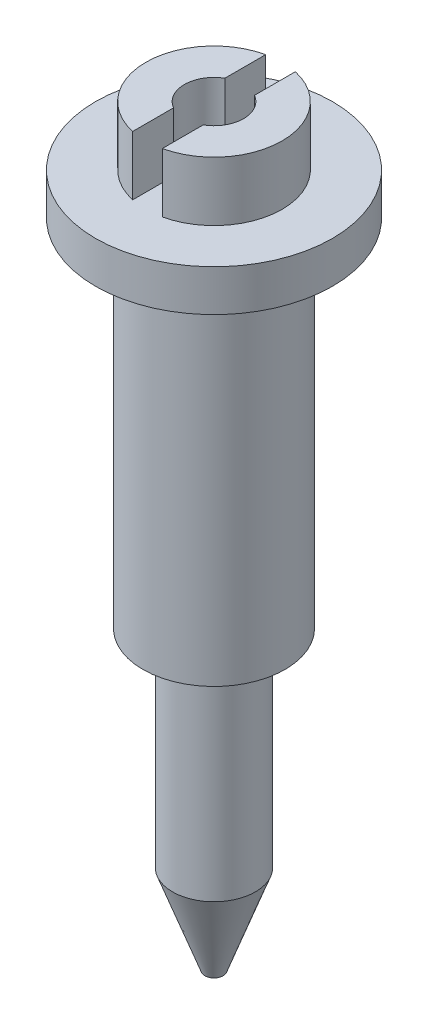
ISO-10303-21;
HEADER;
FILE_DESCRIPTION(('STEP AP214'),'2;1');
FILE_NAME('part.step','',(''),(''),'','','');
FILE_SCHEMA(('AUTOMOTIVE_DESIGN { 1 0 10303 214 1 1 1 1 }'));
ENDSEC;
DATA;
#1=APPLICATION_CONTEXT('core data for automotive mechanical design processes');
#2=APPLICATION_PROTOCOL_DEFINITION('international standard','automotive_design',2000,#1);
#3=PRODUCT_CONTEXT('',#1,'mechanical');
#4=PRODUCT('Part','Part','',(#3));
#5=PRODUCT_RELATED_PRODUCT_CATEGORY('part','',(#4));
#6=PRODUCT_DEFINITION_FORMATION('','',#4);
#7=PRODUCT_DEFINITION_CONTEXT('part definition',#1,'design');
#8=PRODUCT_DEFINITION('design','',#6,#7);
#9=PRODUCT_DEFINITION_SHAPE('','',#8);
#10=(LENGTH_UNIT() NAMED_UNIT(*) SI_UNIT(.MILLI.,.METRE.));
#11=(NAMED_UNIT(*) PLANE_ANGLE_UNIT() SI_UNIT($,.RADIAN.));
#12=(NAMED_UNIT(*) SI_UNIT($,.STERADIAN.) SOLID_ANGLE_UNIT());
#13=UNCERTAINTY_MEASURE_WITH_UNIT(LENGTH_MEASURE(1.E-05),#10,'distance_accuracy_value','');
#14=(GEOMETRIC_REPRESENTATION_CONTEXT(3) GLOBAL_UNCERTAINTY_ASSIGNED_CONTEXT((#13)) GLOBAL_UNIT_ASSIGNED_CONTEXT((#10,
#11,#12)) REPRESENTATION_CONTEXT('',''));
#15=CARTESIAN_POINT('',(0.,0.,0.));
#16=DIRECTION('',(0.,0.,1.));
#17=DIRECTION('',(1.,0.,0.));
#18=AXIS2_PLACEMENT_3D('',#15,#16,#17);
#19=CARTESIAN_POINT('',(0.,1.7,0.));
#20=DIRECTION('',(0.,1.,0.));
#21=DIRECTION('',(0.,0.,1.));
#22=AXIS2_PLACEMENT_3D('',#19,#20,#21);
#23=PLANE('',#22);
#24=DIRECTION('',(0.,0.,1.));
#25=VECTOR('',#24,1.);
#26=CARTESIAN_POINT('',(-0.25,1.7,0.));
#27=LINE('',#26,#25);
#28=CARTESIAN_POINT('',(-0.25,1.7,1.12249721603218));
#29=VERTEX_POINT('',#28);
#30=CARTESIAN_POINT('',(-0.25,1.7,0.433012701892219));
#31=VERTEX_POINT('',#30);
#32=EDGE_CURVE('E106',#29,#31,#27,.F.);
#33=ORIENTED_EDGE('',*,*,#32,.T.);
#34=CARTESIAN_POINT('',(0.,1.7,0.));
#35=DIRECTION('',(0.,1.,0.));
#36=DIRECTION('',(0.,0.,1.));
#37=AXIS2_PLACEMENT_3D('',#34,#35,#36);
#38=CIRCLE('',#37,0.5);
#39=CARTESIAN_POINT('',(-0.25,1.7,-0.433012701892219));
#40=VERTEX_POINT('',#39);
#41=EDGE_CURVE('E22',#31,#40,#38,.F.);
#42=ORIENTED_EDGE('',*,*,#41,.T.);
#43=DIRECTION('',(0.,0.,1.));
#44=VECTOR('',#43,1.);
#45=CARTESIAN_POINT('',(-0.25,1.7,0.));
#46=LINE('',#45,#44);
#47=CARTESIAN_POINT('',(-0.25,1.7,-1.12249721603218));
#48=VERTEX_POINT('',#47);
#49=EDGE_CURVE('E98',#40,#48,#46,.F.);
#50=ORIENTED_EDGE('',*,*,#49,.T.);
#51=CARTESIAN_POINT('',(0.,1.7,0.));
#52=DIRECTION('',(0.,-1.,0.));
#53=DIRECTION('',(0.,0.,-1.));
#54=AXIS2_PLACEMENT_3D('',#51,#52,#53);
#55=CIRCLE('',#54,1.15);
#56=EDGE_CURVE('E170',#29,#48,#55,.T.);
#57=ORIENTED_EDGE('',*,*,#56,.F.);
#58=EDGE_LOOP('',(#33,#42,#50,#57));
#59=FACE_BOUND('',#58,.T.);
#60=ADVANCED_FACE('F17',(#59),#23,.T.);
#61=CARTESIAN_POINT('',(0.,1.7,0.));
#62=DIRECTION('',(0.,1.,0.));
#63=DIRECTION('',(0.,0.,1.));
#64=AXIS2_PLACEMENT_3D('',#61,#62,#63);
#65=PLANE('',#64);
#66=DIRECTION('',(0.,0.,1.));
#67=VECTOR('',#66,1.);
#68=CARTESIAN_POINT('',(0.25,1.7,0.));
#69=LINE('',#68,#67);
#70=CARTESIAN_POINT('',(0.25,1.7,-1.12249721603218));
#71=VERTEX_POINT('',#70);
#72=CARTESIAN_POINT('',(0.25,1.7,-0.433012701892219));
#73=VERTEX_POINT('',#72);
#74=EDGE_CURVE('E118',#71,#73,#69,.T.);
#75=ORIENTED_EDGE('',*,*,#74,.T.);
#76=CARTESIAN_POINT('',(0.,1.7,0.));
#77=DIRECTION('',(0.,1.,0.));
#78=DIRECTION('',(0.,0.,1.));
#79=AXIS2_PLACEMENT_3D('',#76,#77,#78);
#80=CIRCLE('',#79,0.5);
#81=CARTESIAN_POINT('',(0.25,1.7,0.433012701892219));
#82=VERTEX_POINT('',#81);
#83=EDGE_CURVE('E123',#73,#82,#80,.F.);
#84=ORIENTED_EDGE('',*,*,#83,.T.);
#85=DIRECTION('',(0.,0.,1.));
#86=VECTOR('',#85,1.);
#87=CARTESIAN_POINT('',(0.25,1.7,0.));
#88=LINE('',#87,#86);
#89=CARTESIAN_POINT('',(0.25,1.7,1.12249721603218));
#90=VERTEX_POINT('',#89);
#91=EDGE_CURVE('E117',#82,#90,#88,.T.);
#92=ORIENTED_EDGE('',*,*,#91,.T.);
#93=CARTESIAN_POINT('',(0.,1.7,0.));
#94=DIRECTION('',(0.,-1.,0.));
#95=DIRECTION('',(0.,0.,-1.));
#96=AXIS2_PLACEMENT_3D('',#93,#94,#95);
#97=CIRCLE('',#96,1.15);
#98=EDGE_CURVE('E167',#71,#90,#97,.T.);
#99=ORIENTED_EDGE('',*,*,#98,.F.);
#100=EDGE_LOOP('',(#75,#84,#92,#99));
#101=FACE_BOUND('',#100,.T.);
#102=ADVANCED_FACE('F244',(#101),#65,.T.);
#103=CARTESIAN_POINT('',(0.,-11.,0.));
#104=DIRECTION('',(0.,-1.,0.));
#105=DIRECTION('',(0.,0.,-1.));
#106=AXIS2_PLACEMENT_3D('',#103,#104,#105);
#107=PLANE('',#106);
#108=CARTESIAN_POINT('',(0.,-10.9999999999615,0.));
#109=DIRECTION('',(0.,1.,0.));
#110=DIRECTION('',(0.,0.,1.));
#111=AXIS2_PLACEMENT_3D('',#108,#109,#110);
#112=CIRCLE('',#111,0.154044648610352);
#113=CARTESIAN_POINT('',(0.,-10.9999999999615,0.154044648610351));
#114=VERTEX_POINT('',#113);
#115=EDGE_CURVE('E163',#114,#114,#112,.T.);
#116=ORIENTED_EDGE('',*,*,#115,.F.);
#117=EDGE_LOOP('',(#116));
#118=FACE_BOUND('',#117,.T.);
#119=ADVANCED_FACE('F300',(#118),#107,.T.);
#120=CARTESIAN_POINT('',(0.,1.7,0.));
#121=DIRECTION('',(0.,-1.,0.));
#122=DIRECTION('',(0.,0.,-1.));
#123=AXIS2_PLACEMENT_3D('',#120,#121,#122);
#124=CYLINDRICAL_SURFACE('',#123,1.15);
#125=CARTESIAN_POINT('',(0.,0.7,0.));
#126=DIRECTION('',(0.,-1.,0.));
#127=DIRECTION('',(0.,0.,-1.));
#128=AXIS2_PLACEMENT_3D('',#125,#126,#127);
#129=CIRCLE('',#128,1.15);
#130=CARTESIAN_POINT('',(-0.25,0.7,1.12249721603218));
#131=VERTEX_POINT('',#130);
#132=CARTESIAN_POINT('',(-0.25,0.7,-1.12249721603218));
#133=VERTEX_POINT('',#132);
#134=EDGE_CURVE('E133',#131,#133,#129,.T.);
#135=ORIENTED_EDGE('',*,*,#134,.F.);
#136=DIRECTION('',(0.,-1.,0.));
#137=VECTOR('',#136,1.);
#138=CARTESIAN_POINT('',(-0.25,1.7,1.12249721603218));
#139=LINE('',#138,#137);
#140=EDGE_CURVE('E169',#131,#29,#139,.F.);
#141=ORIENTED_EDGE('',*,*,#140,.T.);
#142=ORIENTED_EDGE('',*,*,#56,.T.);
#143=DIRECTION('',(0.,-1.,0.));
#144=VECTOR('',#143,1.);
#145=CARTESIAN_POINT('',(-0.250000000000001,1.7,-1.12249721603218));
#146=LINE('',#145,#144);
#147=EDGE_CURVE('E102',#48,#133,#146,.T.);
#148=ORIENTED_EDGE('',*,*,#147,.T.);
#149=EDGE_LOOP('',(#135,#141,#142,#148));
#150=FACE_BOUND('',#149,.T.);
#151=ADVANCED_FACE('F236',(#150),#124,.T.);
#152=CARTESIAN_POINT('',(0.,1.7,0.));
#153=DIRECTION('',(0.,-1.,0.));
#154=DIRECTION('',(0.,0.,-1.));
#155=AXIS2_PLACEMENT_3D('',#152,#153,#154);
#156=CYLINDRICAL_SURFACE('',#155,1.15);
#157=CARTESIAN_POINT('',(0.,0.7,0.));
#158=DIRECTION('',(0.,-1.,0.));
#159=DIRECTION('',(0.,0.,-1.));
#160=AXIS2_PLACEMENT_3D('',#157,#158,#159);
#161=CIRCLE('',#160,1.15);
#162=CARTESIAN_POINT('',(0.25,0.7,-1.12249721603218));
#163=VERTEX_POINT('',#162);
#164=CARTESIAN_POINT('',(0.25,0.7,1.12249721603218));
#165=VERTEX_POINT('',#164);
#166=EDGE_CURVE('E129',#163,#165,#161,.T.);
#167=ORIENTED_EDGE('',*,*,#166,.F.);
#168=DIRECTION('',(0.,1.,0.));
#169=VECTOR('',#168,1.);
#170=CARTESIAN_POINT('',(0.25,0.7,-1.12249721603218));
#171=LINE('',#170,#169);
#172=EDGE_CURVE('E164',#163,#71,#171,.T.);
#173=ORIENTED_EDGE('',*,*,#172,.T.);
#174=ORIENTED_EDGE('',*,*,#98,.T.);
#175=DIRECTION('',(0.,1.,0.));
#176=VECTOR('',#175,1.);
#177=CARTESIAN_POINT('',(0.25,0.7,1.12249721603218));
#178=LINE('',#177,#176);
#179=EDGE_CURVE('E161',#90,#165,#178,.F.);
#180=ORIENTED_EDGE('',*,*,#179,.T.);
#181=EDGE_LOOP('',(#167,#173,#174,#180));
#182=FACE_BOUND('',#181,.T.);
#183=ADVANCED_FACE('F250',(#182),#156,.T.);
#184=CARTESIAN_POINT('',(0.25,0.7,-1.24293630284455));
#185=DIRECTION('',(1.,0.,0.));
#186=DIRECTION('',(0.,0.,-1.));
#187=AXIS2_PLACEMENT_3D('',#184,#185,#186);
#188=PLANE('',#187);
#189=DIRECTION('',(0.,1.,0.));
#190=VECTOR('',#189,1.);
#191=CARTESIAN_POINT('',(0.25,-4.8,-0.433012701892219));
#192=LINE('',#191,#190);
#193=CARTESIAN_POINT('',(0.25,0.7,-0.433012701892219));
#194=VERTEX_POINT('',#193);
#195=EDGE_CURVE('E152',#194,#73,#192,.T.);
#196=ORIENTED_EDGE('',*,*,#195,.T.);
#197=ORIENTED_EDGE('',*,*,#74,.F.);
#198=ORIENTED_EDGE('',*,*,#172,.F.);
#199=DIRECTION('',(0.,0.,1.));
#200=VECTOR('',#199,1.);
#201=CARTESIAN_POINT('',(0.25,0.7,0.));
#202=LINE('',#201,#200);
#203=EDGE_CURVE('E130',#194,#163,#202,.F.);
#204=ORIENTED_EDGE('',*,*,#203,.F.);
#205=EDGE_LOOP('',(#196,#197,#198,#204));
#206=FACE_BOUND('',#205,.T.);
#207=ADVANCED_FACE('F247',(#206),#188,.F.);
#208=CARTESIAN_POINT('',(0.25,0.7,-1.24293630284455));
#209=DIRECTION('',(1.,0.,0.));
#210=DIRECTION('',(0.,0.,-1.));
#211=AXIS2_PLACEMENT_3D('',#208,#209,#210);
#212=PLANE('',#211);
#213=DIRECTION('',(0.,1.,0.));
#214=VECTOR('',#213,1.);
#215=CARTESIAN_POINT('',(0.25,-4.8,0.433012701892219));
#216=LINE('',#215,#214);
#217=CARTESIAN_POINT('',(0.25,0.7,0.433012701892219));
#218=VERTEX_POINT('',#217);
#219=EDGE_CURVE('E150',#82,#218,#216,.F.);
#220=ORIENTED_EDGE('',*,*,#219,.T.);
#221=DIRECTION('',(0.,0.,1.));
#222=VECTOR('',#221,1.);
#223=CARTESIAN_POINT('',(0.25,0.7,0.));
#224=LINE('',#223,#222);
#225=EDGE_CURVE('E125',#165,#218,#224,.F.);
#226=ORIENTED_EDGE('',*,*,#225,.F.);
#227=ORIENTED_EDGE('',*,*,#179,.F.);
#228=ORIENTED_EDGE('',*,*,#91,.F.);
#229=EDGE_LOOP('',(#220,#226,#227,#228));
#230=FACE_BOUND('',#229,.T.);
#231=ADVANCED_FACE('F253',(#230),#212,.F.);
#232=CARTESIAN_POINT('',(0.,-9.49999999999309,0.));
#233=DIRECTION('',(0.,1.,0.));
#234=DIRECTION('',(0.,0.,1.));
#235=AXIS2_PLACEMENT_3D('',#232,#233,#234);
#236=CONICAL_SURFACE('',#235,0.700000000023238,0.349065850413641);
#237=CARTESIAN_POINT('',(0.,-9.49999999999999,0.));
#238=DIRECTION('',(0.,1.,0.));
#239=DIRECTION('',(0.,0.,1.));
#240=AXIS2_PLACEMENT_3D('',#237,#238,#239);
#241=CIRCLE('',#240,0.7);
#242=CARTESIAN_POINT('',(0.,-9.49999999999999,0.700000000020728));
#243=VERTEX_POINT('',#242);
#244=EDGE_CURVE('E145',#243,#243,#241,.T.);
#245=CARTESIAN_POINT('',(0.,-9.49999999999999,0.700000000020728));
#246=CARTESIAN_POINT('',(0.,-9.51562499999959,0.694312965110203));
#247=CARTESIAN_POINT('',(0.,-9.53124999999919,0.688625930199678));
#248=CARTESIAN_POINT('',(0.,-9.56249999999838,0.677251860378629));
#249=CARTESIAN_POINT('',(0.,-9.57812499999798,0.671564825468104));
#250=CARTESIAN_POINT('',(0.,-9.60937499999718,0.660190755647055));
#251=CARTESIAN_POINT('',(0.,-9.62499999999678,0.65450372073653));
#252=CARTESIAN_POINT('',(0.,-9.65624999999597,0.64312965091548));
#253=CARTESIAN_POINT('',(0.,-9.67187499999557,0.637442616004956));
#254=CARTESIAN_POINT('',(0.,-9.70312499999477,0.626068546183906));
#255=CARTESIAN_POINT('',(0.,-9.71874999999437,0.620381511273381));
#256=CARTESIAN_POINT('',(0.,-9.74999999999357,0.609007441452332));
#257=CARTESIAN_POINT('',(0.,-9.76562499999316,0.603320406541807));
#258=CARTESIAN_POINT('',(0.,-9.79687499999236,0.591946336720757));
#259=CARTESIAN_POINT('',(0.,-9.81249999999196,0.586259301810233));
#260=CARTESIAN_POINT('',(0.,-9.84374999999116,0.574885231989183));
#261=CARTESIAN_POINT('',(0.,-9.85937499999076,0.569198197078659));
#262=CARTESIAN_POINT('',(0.,-9.89062499998995,0.557824127257609));
#263=CARTESIAN_POINT('',(0.,-9.90624999998955,0.552137092347084));
#264=CARTESIAN_POINT('',(0.,-9.93749999998875,0.540763022526035));
#265=CARTESIAN_POINT('',(0.,-9.95312499998835,0.53507598761551));
#266=CARTESIAN_POINT('',(0.,-9.98437499998754,0.523701917794461));
#267=CARTESIAN_POINT('',(0.,-9.99999999998714,0.518014882883936));
#268=CARTESIAN_POINT('',(0.,-10.0312499999863,0.506640813062886));
#269=CARTESIAN_POINT('',(0.,-10.0468749999859,0.500953778152362));
#270=CARTESIAN_POINT('',(0.,-10.0781249999851,0.489579708331312));
#271=CARTESIAN_POINT('',(0.,-10.0937499999847,0.483892673420787));
#272=CARTESIAN_POINT('',(0.,-10.1249999999839,0.472518603599738));
#273=CARTESIAN_POINT('',(0.,-10.1406249999835,0.466831568689213));
#274=CARTESIAN_POINT('',(0.,-10.1718749999827,0.455457498868164));
#275=CARTESIAN_POINT('',(0.,-10.1874999999823,0.449770463957639));
#276=CARTESIAN_POINT('',(0.,-10.2187499999815,0.438396394136589));
#277=CARTESIAN_POINT('',(0.,-10.2343749999811,0.432709359226065));
#278=CARTESIAN_POINT('',(0.,-10.2656249999803,0.421335289405015));
#279=CARTESIAN_POINT('',(0.,-10.2812499999799,0.41564825449449));
#280=CARTESIAN_POINT('',(0.,-10.3124999999791,0.404274184673441));
#281=CARTESIAN_POINT('',(0.,-10.3281249999787,0.398587149762916));
#282=CARTESIAN_POINT('',(0.,-10.3593749999779,0.387213079941866));
#283=CARTESIAN_POINT('',(0.,-10.3749999999775,0.381526045031342));
#284=CARTESIAN_POINT('',(0.,-10.4062499999767,0.370151975210292));
#285=CARTESIAN_POINT('',(0.,-10.4218749999763,0.364464940299767));
#286=CARTESIAN_POINT('',(0.,-10.4531249999755,0.353090870478718));
#287=CARTESIAN_POINT('',(0.,-10.4687499999751,0.347403835568193));
#288=CARTESIAN_POINT('',(0.,-10.4999999999743,0.336029765747144));
#289=CARTESIAN_POINT('',(0.,-10.5156249999739,0.330342730836619));
#290=CARTESIAN_POINT('',(0.,-10.5468749999731,0.318968661015569));
#291=CARTESIAN_POINT('',(0.,-10.5624999999727,0.313281626105045));
#292=CARTESIAN_POINT('',(0.,-10.5937499999719,0.301907556283995));
#293=CARTESIAN_POINT('',(0.,-10.6093749999715,0.29622052137347));
#294=CARTESIAN_POINT('',(0.,-10.6406249999707,0.284846451552421));
#295=CARTESIAN_POINT('',(0.,-10.6562499999703,0.279159416641896));
#296=CARTESIAN_POINT('',(0.,-10.6874999999695,0.267785346820847));
#297=CARTESIAN_POINT('',(0.,-10.7031249999691,0.262098311910322));
#298=CARTESIAN_POINT('',(0.,-10.7343749999683,0.250724242089272));
#299=CARTESIAN_POINT('',(0.,-10.7499999999679,0.245037207178747));
#300=CARTESIAN_POINT('',(0.,-10.7812499999671,0.233663137357698));
#301=CARTESIAN_POINT('',(0.,-10.7968749999667,0.227976102447173));
#302=CARTESIAN_POINT('',(0.,-10.8281249999659,0.216602032626124));
#303=CARTESIAN_POINT('',(0.,-10.8437499999655,0.210914997715599));
#304=CARTESIAN_POINT('',(0.,-10.8749999999647,0.199540927894549));
#305=CARTESIAN_POINT('',(0.,-10.8906249999643,0.193853892984025));
#306=CARTESIAN_POINT('',(0.,-10.9218749999635,0.182479823162975));
#307=CARTESIAN_POINT('',(0.,-10.9374999999631,0.176792788252451));
#308=CARTESIAN_POINT('',(0.,-10.9687499999623,0.165418718431401));
#309=CARTESIAN_POINT('',(0.,-10.9843749999619,0.159731683520876));
#310=CARTESIAN_POINT('',(0.,-10.9999999999615,0.154044648610351));
#311=B_SPLINE_CURVE_WITH_KNOTS('',3,(#245,#246,#247,#248,#249,#250,#251,#252,#253,#254,#255,
#256,#257,#258,#259,#260,#261,#262,#263,#264,#265,#266,#267,#268,#269,#270,#271,#272,#273,#274,
#275,#276,#277,#278,#279,#280,#281,#282,#283,#284,#285,#286,#287,#288,#289,#290,#291,#292,#293,
#294,#295,#296,#297,#298,#299,#300,#301,#302,#303,#304,#305,#306,#307,#308,#309,#310),
.UNSPECIFIED.,.F.,.F.,(4,2,2,2,2,2,2,2,2,2,2,2,2,2,2,2,2,2,2,2,2,2,2,2,2,2,2,2,2,2,2,2,4),(0.,
0.0498833330837938,0.0997666661675893,0.149649999251385,0.19953333233518,0.249416665418976,
0.29929999850277,0.349183331586565,0.399066664670361,0.448949997754156,0.498833330837952,
0.548716663921745,0.598599997005541,0.648483330089336,0.698366663173132,0.748249996256927,
0.798133329340723,0.848016662424517,0.897899995508312,0.947783328592108,0.997666661675903,
1.0475499947597,1.09743332784349,1.14731666092729,1.19719999401108,1.24708332709488,
1.29696666017867,1.34684999326247,1.39673332634626,1.44661665943006,1.49649999251385,
1.54638332559765,1.59626665868144),.UNSPECIFIED.);
#312=EDGE_CURVE('BSEAM255',#243,#114,#311,.T.);
#313=ORIENTED_EDGE('',*,*,#244,.F.);
#314=ORIENTED_EDGE('',*,*,#115,.T.);
#315=ORIENTED_EDGE('',*,*,#312,.T.);
#316=ORIENTED_EDGE('',*,*,#312,.F.);
#317=EDGE_LOOP('',(#313,#315,#314,#316));
#318=FACE_BOUND('',#317,.T.);
#319=ADVANCED_FACE('F255',(#318),#236,.T.);
#320=CARTESIAN_POINT('',(0.,0.7,0.));
#321=DIRECTION('',(0.,1.,0.));
#322=DIRECTION('',(0.,0.,1.));
#323=AXIS2_PLACEMENT_3D('',#320,#321,#322);
#324=PLANE('',#323);
#325=CARTESIAN_POINT('',(0.,0.7,0.));
#326=DIRECTION('',(0.,-1.,0.));
#327=DIRECTION('',(0.,0.,-1.));
#328=AXIS2_PLACEMENT_3D('',#325,#326,#327);
#329=CIRCLE('',#328,2.);
#330=CARTESIAN_POINT('',(0.,0.7,-2.));
#331=VERTEX_POINT('',#330);
#332=EDGE_CURVE('E148',#331,#331,#329,.T.);
#333=ORIENTED_EDGE('',*,*,#332,.F.);
#334=EDGE_LOOP('',(#333));
#335=FACE_BOUND('',#334,.T.);
#336=CARTESIAN_POINT('',(0.,0.7,0.));
#337=DIRECTION('',(0.,1.,0.));
#338=DIRECTION('',(0.,0.,1.));
#339=AXIS2_PLACEMENT_3D('',#336,#337,#338);
#340=CIRCLE('',#339,0.5);
#341=CARTESIAN_POINT('',(-0.25,0.7,0.433012701892219));
#342=VERTEX_POINT('',#341);
#343=EDGE_CURVE('E149',#218,#342,#340,.F.);
#344=ORIENTED_EDGE('',*,*,#343,.T.);
#345=DIRECTION('',(0.,0.,1.));
#346=VECTOR('',#345,1.);
#347=CARTESIAN_POINT('',(-0.25,0.7,-1.24293630284456));
#348=LINE('',#347,#346);
#349=EDGE_CURVE('E128',#342,#131,#348,.T.);
#350=ORIENTED_EDGE('',*,*,#349,.T.);
#351=ORIENTED_EDGE('',*,*,#134,.T.);
#352=DIRECTION('',(0.,0.,1.));
#353=VECTOR('',#352,1.);
#354=CARTESIAN_POINT('',(-0.25,0.7,-1.24293630284456));
#355=LINE('',#354,#353);
#356=CARTESIAN_POINT('',(-0.25,0.7,-0.433012701892219));
#357=VERTEX_POINT('',#356);
#358=EDGE_CURVE('E155',#133,#357,#355,.T.);
#359=ORIENTED_EDGE('',*,*,#358,.T.);
#360=CARTESIAN_POINT('',(0.,0.7,0.));
#361=DIRECTION('',(0.,1.,0.));
#362=DIRECTION('',(0.,0.,1.));
#363=AXIS2_PLACEMENT_3D('',#360,#361,#362);
#364=CIRCLE('',#363,0.5);
#365=EDGE_CURVE('E111',#357,#194,#364,.F.);
#366=ORIENTED_EDGE('',*,*,#365,.T.);
#367=ORIENTED_EDGE('',*,*,#203,.T.);
#368=ORIENTED_EDGE('',*,*,#166,.T.);
#369=ORIENTED_EDGE('',*,*,#225,.T.);
#370=EDGE_LOOP('',(#344,#350,#351,#359,#366,#367,#368,#369));
#371=FACE_BOUND('',#370,.T.);
#372=ADVANCED_FACE('F227',(#335,#371),#324,.T.);
#373=CARTESIAN_POINT('',(-0.25,0.7,-1.24293630284456));
#374=DIRECTION('',(-1.,0.,0.));
#375=DIRECTION('',(0.,0.,1.));
#376=AXIS2_PLACEMENT_3D('',#373,#374,#375);
#377=PLANE('',#376);
#378=DIRECTION('',(0.,1.,0.));
#379=VECTOR('',#378,1.);
#380=CARTESIAN_POINT('',(-0.25,-4.8,0.433012701892219));
#381=LINE('',#380,#379);
#382=EDGE_CURVE('E114',#342,#31,#381,.T.);
#383=ORIENTED_EDGE('',*,*,#382,.T.);
#384=ORIENTED_EDGE('',*,*,#32,.F.);
#385=ORIENTED_EDGE('',*,*,#140,.F.);
#386=ORIENTED_EDGE('',*,*,#349,.F.);
#387=EDGE_LOOP('',(#383,#384,#385,#386));
#388=FACE_BOUND('',#387,.T.);
#389=ADVANCED_FACE('F233',(#388),#377,.F.);
#390=CARTESIAN_POINT('',(-0.25,0.7,-1.24293630284456));
#391=DIRECTION('',(-1.,0.,0.));
#392=DIRECTION('',(0.,0.,1.));
#393=AXIS2_PLACEMENT_3D('',#390,#391,#392);
#394=PLANE('',#393);
#395=DIRECTION('',(0.,1.,0.));
#396=VECTOR('',#395,1.);
#397=CARTESIAN_POINT('',(-0.25,-4.8,-0.433012701892219));
#398=LINE('',#397,#396);
#399=EDGE_CURVE('E101',#40,#357,#398,.F.);
#400=ORIENTED_EDGE('',*,*,#399,.T.);
#401=ORIENTED_EDGE('',*,*,#358,.F.);
#402=ORIENTED_EDGE('',*,*,#147,.F.);
#403=ORIENTED_EDGE('',*,*,#49,.F.);
#404=EDGE_LOOP('',(#400,#401,#402,#403));
#405=FACE_BOUND('',#404,.T.);
#406=ADVANCED_FACE('F99',(#405),#394,.F.);
#407=CARTESIAN_POINT('',(0.,-4.8,0.));
#408=DIRECTION('',(0.,1.,0.));
#409=DIRECTION('',(0.,0.,1.));
#410=AXIS2_PLACEMENT_3D('',#407,#408,#409);
#411=PLANE('',#410);
#412=CARTESIAN_POINT('',(0.,-4.8,0.));
#413=DIRECTION('',(0.,1.,0.));
#414=DIRECTION('',(0.,0.,1.));
#415=AXIS2_PLACEMENT_3D('',#412,#413,#414);
#416=CIRCLE('',#415,0.5);
#417=CARTESIAN_POINT('',(0.,-4.8,0.5));
#418=VERTEX_POINT('',#417);
#419=EDGE_CURVE('E113',#418,#418,#416,.T.);
#420=ORIENTED_EDGE('',*,*,#419,.T.);
#421=EDGE_LOOP('',(#420));
#422=FACE_BOUND('',#421,.T.);
#423=ADVANCED_FACE('F295',(#422),#411,.T.);
#424=CARTESIAN_POINT('',(0.,-11.,0.));
#425=DIRECTION('',(0.,1.,0.));
#426=DIRECTION('',(0.,0.,1.));
#427=AXIS2_PLACEMENT_3D('',#424,#425,#426);
#428=CYLINDRICAL_SURFACE('',#427,0.7);
#429=CARTESIAN_POINT('',(0.,-6.,0.));
#430=DIRECTION('',(0.,1.,0.));
#431=DIRECTION('',(0.,0.,1.));
#432=AXIS2_PLACEMENT_3D('',#429,#430,#431);
#433=CIRCLE('',#432,0.7);
#434=CARTESIAN_POINT('',(0.,-6.,0.7));
#435=VERTEX_POINT('',#434);
#436=EDGE_CURVE('E219',#435,#435,#433,.T.);
#437=CARTESIAN_POINT('',(0.,-6.,0.7));
#438=CARTESIAN_POINT('',(0.,-6.03645833333333,0.7));
#439=CARTESIAN_POINT('',(0.,-6.07291666666667,0.7));
#440=CARTESIAN_POINT('',(0.,-6.14583333333333,0.7));
#441=CARTESIAN_POINT('',(0.,-6.18229166666667,0.7));
#442=CARTESIAN_POINT('',(0.,-6.25520833333333,0.7));
#443=CARTESIAN_POINT('',(0.,-6.29166666666667,0.7));
#444=CARTESIAN_POINT('',(0.,-6.36458333333333,0.7));
#445=CARTESIAN_POINT('',(0.,-6.40104166666667,0.7));
#446=CARTESIAN_POINT('',(0.,-6.47395833333333,0.7));
#447=CARTESIAN_POINT('',(0.,-6.51041666666666,0.7));
#448=CARTESIAN_POINT('',(0.,-6.58333333333333,0.7));
#449=CARTESIAN_POINT('',(0.,-6.61979166666666,0.7));
#450=CARTESIAN_POINT('',(0.,-6.69270833333333,0.7));
#451=CARTESIAN_POINT('',(0.,-6.72916666666666,0.7));
#452=CARTESIAN_POINT('',(0.,-6.80208333333333,0.7));
#453=CARTESIAN_POINT('',(0.,-6.83854166666666,0.7));
#454=CARTESIAN_POINT('',(0.,-6.91145833333333,0.7));
#455=CARTESIAN_POINT('',(0.,-6.94791666666666,0.7));
#456=CARTESIAN_POINT('',(0.,-7.02083333333333,0.7));
#457=CARTESIAN_POINT('',(0.,-7.05729166666666,0.7));
#458=CARTESIAN_POINT('',(0.,-7.13020833333333,0.7));
#459=CARTESIAN_POINT('',(0.,-7.16666666666666,0.7));
#460=CARTESIAN_POINT('',(0.,-7.23958333333333,0.7));
#461=CARTESIAN_POINT('',(0.,-7.27604166666666,0.7));
#462=CARTESIAN_POINT('',(0.,-7.34895833333333,0.7));
#463=CARTESIAN_POINT('',(0.,-7.38541666666666,0.7));
#464=CARTESIAN_POINT('',(0.,-7.45833333333333,0.7));
#465=CARTESIAN_POINT('',(0.,-7.49479166666666,0.7));
#466=CARTESIAN_POINT('',(0.,-7.56770833333333,0.7));
#467=CARTESIAN_POINT('',(0.,-7.60416666666666,0.7));
#468=CARTESIAN_POINT('',(0.,-7.67708333333333,0.7));
#469=CARTESIAN_POINT('',(0.,-7.71354166666666,0.7));
#470=CARTESIAN_POINT('',(0.,-7.78645833333333,0.7));
#471=CARTESIAN_POINT('',(0.,-7.82291666666666,0.7));
#472=CARTESIAN_POINT('',(0.,-7.89583333333333,0.7));
#473=CARTESIAN_POINT('',(0.,-7.93229166666666,0.7));
#474=CARTESIAN_POINT('',(0.,-8.00520833333333,0.7));
#475=CARTESIAN_POINT('',(0.,-8.04166666666666,0.7));
#476=CARTESIAN_POINT('',(0.,-8.11458333333333,0.7));
#477=CARTESIAN_POINT('',(0.,-8.15104166666666,0.7));
#478=CARTESIAN_POINT('',(0.,-8.22395833333333,0.7));
#479=CARTESIAN_POINT('',(0.,-8.26041666666666,0.7));
#480=CARTESIAN_POINT('',(0.,-8.33333333333333,0.7));
#481=CARTESIAN_POINT('',(0.,-8.36979166666666,0.7));
#482=CARTESIAN_POINT('',(0.,-8.44270833333333,0.7));
#483=CARTESIAN_POINT('',(0.,-8.47916666666666,0.7));
#484=CARTESIAN_POINT('',(0.,-8.55208333333333,0.7));
#485=CARTESIAN_POINT('',(0.,-8.58854166666666,0.7));
#486=CARTESIAN_POINT('',(0.,-8.66145833333332,0.7));
#487=CARTESIAN_POINT('',(0.,-8.69791666666666,0.7));
#488=CARTESIAN_POINT('',(0.,-8.77083333333332,0.7));
#489=CARTESIAN_POINT('',(0.,-8.80729166666666,0.7));
#490=CARTESIAN_POINT('',(0.,-8.88020833333332,0.7));
#491=CARTESIAN_POINT('',(0.,-8.91666666666666,0.7));
#492=CARTESIAN_POINT('',(0.,-8.98958333333332,0.7));
#493=CARTESIAN_POINT('',(0.,-9.02604166666666,0.7));
#494=CARTESIAN_POINT('',(0.,-9.09895833333332,0.7));
#495=CARTESIAN_POINT('',(0.,-9.13541666666666,0.7));
#496=CARTESIAN_POINT('',(0.,-9.20833333333332,0.7));
#497=CARTESIAN_POINT('',(0.,-9.24479166666666,0.7));
#498=CARTESIAN_POINT('',(0.,-9.31770833333332,0.7));
#499=CARTESIAN_POINT('',(0.,-9.35416666666666,0.7));
#500=CARTESIAN_POINT('',(0.,-9.42708333333332,0.7));
#501=CARTESIAN_POINT('',(0.,-9.46354166666666,0.7));
#502=CARTESIAN_POINT('',(0.,-9.49999999999999,0.7));
#503=B_SPLINE_CURVE_WITH_KNOTS('',3,(#437,#438,#439,#440,#441,#442,#443,#444,#445,#446,#447,
#448,#449,#450,#451,#452,#453,#454,#455,#456,#457,#458,#459,#460,#461,#462,#463,#464,#465,#466,
#467,#468,#469,#470,#471,#472,#473,#474,#475,#476,#477,#478,#479,#480,#481,#482,#483,#484,#485,
#486,#487,#488,#489,#490,#491,#492,#493,#494,#495,#496,#497,#498,#499,#500,#501,#502),
.UNSPECIFIED.,.F.,.F.,(4,2,2,2,2,2,2,2,2,2,2,2,2,2,2,2,2,2,2,2,2,2,2,2,2,2,2,2,2,2,2,2,4),(0.,
0.109375,0.218749999999999,0.328124999999999,0.437499999999999,0.546874999999999,
0.656249999999998,0.765624999999998,0.874999999999997,0.984374999999997,1.09375,1.203125,1.3125,
1.421875,1.53125,1.640625,1.74999999999999,1.859375,1.96874999999999,2.07812499999999,
2.18749999999999,2.29687499999999,2.40624999999999,2.51562499999999,2.62499999999999,
2.73437499999999,2.84374999999999,2.95312499999999,3.06249999999999,3.17187499999999,
3.28124999999999,3.39062499999999,3.49999999999999),.UNSPECIFIED.);
#504=EDGE_CURVE('BSEAM292',#435,#243,#503,.T.);
#505=ORIENTED_EDGE('',*,*,#436,.F.);
#506=ORIENTED_EDGE('',*,*,#244,.T.);
#507=ORIENTED_EDGE('',*,*,#504,.T.);
#508=ORIENTED_EDGE('',*,*,#504,.F.);
#509=EDGE_LOOP('',(#505,#507,#506,#508));
#510=FACE_BOUND('',#509,.T.);
#511=ADVANCED_FACE('F292',(#510),#428,.T.);
#512=CARTESIAN_POINT('',(0.,0.7,0.));
#513=DIRECTION('',(0.,-1.,0.));
#514=DIRECTION('',(0.,0.,-1.));
#515=AXIS2_PLACEMENT_3D('',#512,#513,#514);
#516=CYLINDRICAL_SURFACE('',#515,2.);
#517=CARTESIAN_POINT('',(0.,0.,0.));
#518=DIRECTION('',(0.,-1.,0.));
#519=DIRECTION('',(0.,0.,-1.));
#520=AXIS2_PLACEMENT_3D('',#517,#518,#519);
#521=CIRCLE('',#520,2.);
#522=CARTESIAN_POINT('',(0.,0.,-2.));
#523=VERTEX_POINT('',#522);
#524=EDGE_CURVE('E282',#523,#523,#521,.F.);
#525=CARTESIAN_POINT('',(0.,0.7,-2.));
#526=CARTESIAN_POINT('',(0.,0.692708333333333,-2.));
#527=CARTESIAN_POINT('',(0.,0.685416666666667,-2.));
#528=CARTESIAN_POINT('',(0.,0.670833333333334,-2.));
#529=CARTESIAN_POINT('',(0.,0.663541666666667,-2.));
#530=CARTESIAN_POINT('',(0.,0.648958333333334,-2.));
#531=CARTESIAN_POINT('',(0.,0.641666666666667,-2.));
#532=CARTESIAN_POINT('',(0.,0.627083333333334,-2.));
#533=CARTESIAN_POINT('',(0.,0.619791666666667,-2.));
#534=CARTESIAN_POINT('',(0.,0.605208333333333,-2.));
#535=CARTESIAN_POINT('',(0.,0.597916666666667,-2.));
#536=CARTESIAN_POINT('',(0.,0.583333333333333,-2.));
#537=CARTESIAN_POINT('',(0.,0.576041666666667,-2.));
#538=CARTESIAN_POINT('',(0.,0.561458333333334,-2.));
#539=CARTESIAN_POINT('',(0.,0.554166666666667,-2.));
#540=CARTESIAN_POINT('',(0.,0.539583333333333,-2.));
#541=CARTESIAN_POINT('',(0.,0.532291666666667,-2.));
#542=CARTESIAN_POINT('',(0.,0.517708333333333,-2.));
#543=CARTESIAN_POINT('',(0.,0.510416666666667,-2.));
#544=CARTESIAN_POINT('',(0.,0.495833333333333,-2.));
#545=CARTESIAN_POINT('',(0.,0.488541666666667,-2.));
#546=CARTESIAN_POINT('',(0.,0.473958333333333,-2.));
#547=CARTESIAN_POINT('',(0.,0.466666666666667,-2.));
#548=CARTESIAN_POINT('',(0.,0.452083333333333,-2.));
#549=CARTESIAN_POINT('',(0.,0.444791666666667,-2.));
#550=CARTESIAN_POINT('',(0.,0.430208333333333,-2.));
#551=CARTESIAN_POINT('',(0.,0.422916666666667,-2.));
#552=CARTESIAN_POINT('',(0.,0.408333333333333,-2.));
#553=CARTESIAN_POINT('',(0.,0.401041666666667,-2.));
#554=CARTESIAN_POINT('',(0.,0.386458333333333,-2.));
#555=CARTESIAN_POINT('',(0.,0.379166666666667,-2.));
#556=CARTESIAN_POINT('',(0.,0.364583333333333,-2.));
#557=CARTESIAN_POINT('',(0.,0.357291666666667,-2.));
#558=CARTESIAN_POINT('',(0.,0.342708333333333,-2.));
#559=CARTESIAN_POINT('',(0.,0.335416666666667,-2.));
#560=CARTESIAN_POINT('',(0.,0.320833333333333,-2.));
#561=CARTESIAN_POINT('',(0.,0.313541666666667,-2.));
#562=CARTESIAN_POINT('',(0.,0.298958333333333,-2.));
#563=CARTESIAN_POINT('',(0.,0.291666666666667,-2.));
#564=CARTESIAN_POINT('',(0.,0.277083333333333,-2.));
#565=CARTESIAN_POINT('',(0.,0.269791666666667,-2.));
#566=CARTESIAN_POINT('',(0.,0.255208333333333,-2.));
#567=CARTESIAN_POINT('',(0.,0.247916666666667,-2.));
#568=CARTESIAN_POINT('',(0.,0.233333333333333,-2.));
#569=CARTESIAN_POINT('',(0.,0.226041666666667,-2.));
#570=CARTESIAN_POINT('',(0.,0.211458333333333,-2.));
#571=CARTESIAN_POINT('',(0.,0.204166666666667,-2.));
#572=CARTESIAN_POINT('',(0.,0.189583333333334,-2.));
#573=CARTESIAN_POINT('',(0.,0.182291666666667,-2.));
#574=CARTESIAN_POINT('',(0.,0.167708333333333,-2.));
#575=CARTESIAN_POINT('',(0.,0.160416666666667,-2.));
#576=CARTESIAN_POINT('',(0.,0.145833333333334,-2.));
#577=CARTESIAN_POINT('',(0.,0.138541666666667,-2.));
#578=CARTESIAN_POINT('',(0.,0.123958333333333,-2.));
#579=CARTESIAN_POINT('',(0.,0.116666666666667,-2.));
#580=CARTESIAN_POINT('',(0.,0.102083333333333,-2.));
#581=CARTESIAN_POINT('',(0.,0.0947916666666668,-2.));
#582=CARTESIAN_POINT('',(0.,0.0802083333333335,-2.));
#583=CARTESIAN_POINT('',(0.,0.0729166666666668,-2.));
#584=CARTESIAN_POINT('',(0.,0.0583333333333335,-2.));
#585=CARTESIAN_POINT('',(0.,0.0510416666666668,-2.));
#586=CARTESIAN_POINT('',(0.,0.0364583333333335,-2.));
#587=CARTESIAN_POINT('',(0.,0.0291666666666668,-2.));
#588=CARTESIAN_POINT('',(0.,0.0145833333333334,-2.));
#589=CARTESIAN_POINT('',(0.,0.00729166666666675,-2.));
#590=CARTESIAN_POINT('',(0.,0.,-2.));
#591=B_SPLINE_CURVE_WITH_KNOTS('',3,(#525,#526,#527,#528,#529,#530,#531,#532,#533,#534,#535,
#536,#537,#538,#539,#540,#541,#542,#543,#544,#545,#546,#547,#548,#549,#550,#551,#552,#553,#554,
#555,#556,#557,#558,#559,#560,#561,#562,#563,#564,#565,#566,#567,#568,#569,#570,#571,#572,#573,
#574,#575,#576,#577,#578,#579,#580,#581,#582,#583,#584,#585,#586,#587,#588,#589,#590),
.UNSPECIFIED.,.F.,.F.,(4,2,2,2,2,2,2,2,2,2,2,2,2,2,2,2,2,2,2,2,2,2,2,2,2,2,2,2,2,2,2,2,4),(0.,
0.0218750000000001,0.0437500000000001,0.065625,0.0875,0.109375,0.13125,0.153125,0.175,0.196875,
0.21875,0.240625,0.2625,0.284375,0.30625,0.328125,0.35,0.371875,0.39375,0.415625,0.4375,
0.459375,0.48125,0.503125,0.525,0.546875,0.56875,0.590625,0.6125,0.634375,0.65625,0.678125,0.7),.UNSPECIFIED.);
#592=EDGE_CURVE('BSEAM209',#331,#523,#591,.T.);
#593=ORIENTED_EDGE('',*,*,#332,.T.);
#594=ORIENTED_EDGE('',*,*,#524,.T.);
#595=ORIENTED_EDGE('',*,*,#592,.T.);
#596=ORIENTED_EDGE('',*,*,#592,.F.);
#597=EDGE_LOOP('',(#593,#595,#594,#596));
#598=FACE_BOUND('',#597,.T.);
#599=ADVANCED_FACE('F209',(#598),#516,.T.);
#600=CARTESIAN_POINT('',(0.,-4.8,0.));
#601=DIRECTION('',(0.,1.,0.));
#602=DIRECTION('',(0.,0.,1.));
#603=AXIS2_PLACEMENT_3D('',#600,#601,#602);
#604=CYLINDRICAL_SURFACE('',#603,0.5);
#605=ORIENTED_EDGE('',*,*,#382,.F.);
#606=ORIENTED_EDGE('',*,*,#343,.F.);
#607=ORIENTED_EDGE('',*,*,#219,.F.);
#608=ORIENTED_EDGE('',*,*,#83,.F.);
#609=ORIENTED_EDGE('',*,*,#195,.F.);
#610=ORIENTED_EDGE('',*,*,#365,.F.);
#611=ORIENTED_EDGE('',*,*,#399,.F.);
#612=ORIENTED_EDGE('',*,*,#41,.F.);
#613=EDGE_LOOP('',(#605,#606,#607,#608,#609,#610,#611,#612));
#614=FACE_BOUND('',#613,.T.);
#615=CARTESIAN_POINT('',(0.,-2.5,0.));
#616=DIRECTION('',(-0.0814496755849569,0.707106781186547,0.702400135497642));
#617=DIRECTION('',(0.0814496755849569,0.707106781186547,-0.702400135497642));
#618=AXIS2_PLACEMENT_3D('',#615,#616,#617);
#619=ELLIPSE('',#618,0.707106781186547,0.5);
#620=CARTESIAN_POINT('',(-0.432169867306075,-2.29999999999579,-0.251454182293016));
#621=VERTEX_POINT('',#620);
#622=CARTESIAN_POINT('',(0.478244761647119,-2.29999999999579,-0.14588333680407));
#623=VERTEX_POINT('',#622);
#624=EDGE_CURVE('E280',#621,#623,#619,.F.);
#625=ORIENTED_EDGE('',*,*,#624,.T.);
#626=CARTESIAN_POINT('',(0.478244761652936,-2.70000000000843,-0.145883336785002));
#627=CARTESIAN_POINT('',(0.479624163320204,-2.67760305902485,-0.141342696813131));
#628=CARTESIAN_POINT('',(0.480745194410389,-2.65504656461004,-0.137452534243036));
#629=CARTESIAN_POINT('',(0.482505341155897,-2.60969554928123,-0.131152022312625));
#630=CARTESIAN_POINT('',(0.483144135152104,-2.58690087975795,-0.128742660866829));
#631=CARTESIAN_POINT('',(0.483966511636902,-2.54153632985114,-0.125613400214635));
#632=CARTESIAN_POINT('',(0.484156945501716,-2.51896838561295,-0.124868082080874));
#633=CARTESIAN_POINT('',(0.484111523195988,-2.47385131181174,-0.125044247551362));
#634=CARTESIAN_POINT('',(0.483875890703093,-2.45130217859048,-0.125964856572168));
#635=CARTESIAN_POINT('',(0.482985999039726,-2.40725354571126,-0.12933512349402));
#636=CARTESIAN_POINT('',(0.482349148800145,-2.38574864342629,-0.131721095559475));
#637=CARTESIAN_POINT('',(0.480636845276637,-2.34278060006506,-0.137830306476163));
#638=CARTESIAN_POINT('',(0.479558131392076,-2.3213189877141,-0.141563461549546));
#639=CARTESIAN_POINT('',(0.478244761652936,-2.29999999999157,-0.145883336785002));
#640=B_SPLINE_CURVE_WITH_KNOTS('',3,(#626,#627,#628,#629,#630,#631,#632,#633,#634,#635,#636,
#637,#638,#639),.UNSPECIFIED.,.F.,.F.,(4,2,2,2,2,2,4),(0.,0.0686889715317415,0.137423719217454,
0.205101117171114,0.272742995948046,0.33763486276415,0.403014462294351),.UNSPECIFIED.);
#641=CARTESIAN_POINT('',(0.478244761642805,-2.70000000000083,-0.145883336819461));
#642=VERTEX_POINT('',#641);
#643=EDGE_CURVE('E156',#642,#623,#640,.T.);
#644=ORIENTED_EDGE('',*,*,#643,.F.);
#645=CARTESIAN_POINT('',(0.,-2.5,0.));
#646=DIRECTION('',(0.0814496755849569,0.707106781186547,-0.702400135497642));
#647=DIRECTION('',(-0.0814496755849569,0.707106781186547,0.702400135497642));
#648=AXIS2_PLACEMENT_3D('',#645,#646,#647);
#649=ELLIPSE('',#648,0.707106781186547,0.5);
#650=CARTESIAN_POINT('',(-0.432169867305921,-2.70000000000566,-0.251454182293281));
#651=VERTEX_POINT('',#650);
#652=EDGE_CURVE('E37',#642,#651,#649,.T.);
#653=ORIENTED_EDGE('',*,*,#652,.T.);
#654=CARTESIAN_POINT('',(-0.432169867299832,-2.70000000000903,-0.251454182279594));
#655=CARTESIAN_POINT('',(-0.433926506001616,-2.68347635508804,-0.248434021247031));
#656=CARTESIAN_POINT('',(-0.435465369413539,-2.66687383303175,-0.245717850259056));
#657=CARTESIAN_POINT('',(-0.438104926713679,-2.63352785365465,-0.24098014742869));
#658=CARTESIAN_POINT('',(-0.439205411534351,-2.61678433296765,-0.238958947088127));
#659=CARTESIAN_POINT('',(-0.44182183671702,-2.56679871998593,-0.23411137375861));
#660=CARTESIAN_POINT('',(-0.442695409280587,-2.533399359993,-0.232423696299805));
#661=CARTESIAN_POINT('',(-0.44269540928117,-2.4666006400074,-0.232423696299684));
#662=CARTESIAN_POINT('',(-0.441821836718207,-2.43320128001473,-0.234111373758327));
#663=CARTESIAN_POINT('',(-0.439205411533844,-2.38321566703381,-0.238958947088096));
#664=CARTESIAN_POINT('',(-0.438104926712161,-2.36647214634716,-0.240980147428826));
#665=CARTESIAN_POINT('',(-0.435465369415349,-2.33312616697014,-0.245717850258394));
#666=CARTESIAN_POINT('',(-0.433926506007764,-2.31652364491358,-0.248434021245401));
#667=CARTESIAN_POINT('',(-0.432169867316101,-2.29999999999157,-0.251454182275786));
#668=B_SPLINE_CURVE_WITH_KNOTS('',3,(#654,#655,#656,#657,#658,#659,#660,#661,#662,#663,#664,
#665,#666,#667),.UNSPECIFIED.,.F.,.F.,(4,2,2,2,2,2,4),(0.,0.050661063735989,0.101346259444462,
0.201487244652394,0.301628229859135,0.35231342556695,0.402974489302107),.UNSPECIFIED.);
#669=EDGE_CURVE('E213',#651,#621,#668,.T.);
#670=ORIENTED_EDGE('',*,*,#669,.T.);
#671=EDGE_LOOP('',(#625,#644,#653,#670));
#672=FACE_BOUND('',#671,.T.);
#673=ORIENTED_EDGE('',*,*,#419,.F.);
#674=EDGE_LOOP('',(#673));
#675=FACE_BOUND('',#674,.T.);
#676=ADVANCED_FACE('F108',(#614,#672,#675),#604,.F.);
#677=CARTESIAN_POINT('',(0.0230374471710055,-2.5,-0.198668759552711));
#678=DIRECTION('',(0.115187235863135,0.,-0.993343797833464));
#679=DIRECTION('',(-0.993343797833464,0.,-0.115187235863135));
#680=AXIS2_PLACEMENT_3D('',#677,#678,#679);
#681=CONICAL_SURFACE('',#680,0.500000000055378,1.02974425939942);
#682=ORIENTED_EDGE('',*,*,#669,.F.);
#683=CARTESIAN_POINT('',(0.0230374471726268,-2.5,-0.198668759566693));
#684=DIRECTION('',(0.115187235863135,0.,-0.993343797833464));
#685=DIRECTION('',(-0.993343797833464,0.,-0.115187235863135));
#686=AXIS2_PLACEMENT_3D('',#683,#684,#685);
#687=CIRCLE('',#686,0.499999999999999);
#688=EDGE_CURVE('E138',#651,#621,#687,.T.);
#689=ORIENTED_EDGE('',*,*,#688,.T.);
#690=EDGE_LOOP('',(#682,#689));
#691=FACE_BOUND('',#690,.T.);
#692=ADVANCED_FACE('F193',(#691),#681,.F.);
#693=CARTESIAN_POINT('',(0.0230374471710055,-2.5,-0.198668759552711));
#694=DIRECTION('',(0.115187235863135,0.,-0.993343797833464));
#695=DIRECTION('',(-0.993343797833464,0.,-0.115187235863135));
#696=AXIS2_PLACEMENT_3D('',#693,#694,#695);
#697=CONICAL_SURFACE('',#696,0.500000000055378,1.02974425843514);
#698=CARTESIAN_POINT('',(0.0230374471726268,-2.5,-0.198668759566693));
#699=DIRECTION('',(0.115187235863135,0.,-0.993343797833464));
#700=DIRECTION('',(-0.993343797833464,0.,-0.115187235863135));
#701=AXIS2_PLACEMENT_3D('',#698,#699,#700);
#702=CIRCLE('',#701,0.499999999999999);
#703=EDGE_CURVE('E134',#623,#642,#702,.T.);
#704=ORIENTED_EDGE('',*,*,#703,.T.);
#705=ORIENTED_EDGE('',*,*,#643,.T.);
#706=EDGE_LOOP('',(#704,#705));
#707=FACE_BOUND('',#706,.T.);
#708=ADVANCED_FACE('F188',(#707),#697,.F.);
#709=CARTESIAN_POINT('',(0.,-6.,0.));
#710=DIRECTION('',(0.,-1.,0.));
#711=DIRECTION('',(0.,0.,-1.));
#712=AXIS2_PLACEMENT_3D('',#709,#710,#711);
#713=PLANE('',#712);
#714=ORIENTED_EDGE('',*,*,#436,.T.);
#715=EDGE_LOOP('',(#714));
#716=FACE_BOUND('',#715,.T.);
#717=CARTESIAN_POINT('',(0.,-6.,0.));
#718=DIRECTION('',(0.,1.,0.));
#719=DIRECTION('',(0.,0.,1.));
#720=AXIS2_PLACEMENT_3D('',#717,#718,#719);
#721=CIRCLE('',#720,1.2);
#722=CARTESIAN_POINT('',(0.,-6.,1.2));
#723=VERTEX_POINT('',#722);
#724=EDGE_CURVE('E137',#723,#723,#721,.T.);
#725=ORIENTED_EDGE('',*,*,#724,.F.);
#726=EDGE_LOOP('',(#725));
#727=FACE_BOUND('',#726,.T.);
#728=ADVANCED_FACE('F184',(#716,#727),#713,.T.);
#729=CARTESIAN_POINT('',(0.,0.,0.));
#730=DIRECTION('',(0.,1.,0.));
#731=DIRECTION('',(0.,0.,1.));
#732=AXIS2_PLACEMENT_3D('',#729,#730,#731);
#733=PLANE('',#732);
#734=CARTESIAN_POINT('',(0.,0.,0.));
#735=DIRECTION('',(0.,1.,0.));
#736=DIRECTION('',(0.,0.,1.));
#737=AXIS2_PLACEMENT_3D('',#734,#735,#736);
#738=CIRCLE('',#737,1.2);
#739=CARTESIAN_POINT('',(0.,0.,1.2));
#740=VERTEX_POINT('',#739);
#741=EDGE_CURVE('E28',#740,#740,#738,.F.);
#742=ORIENTED_EDGE('',*,*,#741,.F.);
#743=EDGE_LOOP('',(#742));
#744=FACE_BOUND('',#743,.T.);
#745=ORIENTED_EDGE('',*,*,#524,.F.);
#746=EDGE_LOOP('',(#745));
#747=FACE_BOUND('',#746,.T.);
#748=ADVANCED_FACE('F180',(#744,#747),#733,.F.);
#749=CARTESIAN_POINT('',(0.138224683035762,-2.5,-1.19201255740016));
#750=DIRECTION('',(0.115187235863135,0.,-0.993343797833464));
#751=DIRECTION('',(-0.993343797833464,0.,-0.115187235863135));
#752=AXIS2_PLACEMENT_3D('',#749,#750,#751);
#753=CYLINDRICAL_SURFACE('',#752,0.499999999999999);
#754=CARTESIAN_POINT('',(0.622326338447889,-2.5,-1.02601653421085));
#755=CARTESIAN_POINT('',(0.622325167507937,-2.47329225479466,-1.02601811996845));
#756=CARTESIAN_POINT('',(0.620304729016056,-2.44656988796276,-1.02725114682138));
#757=CARTESIAN_POINT('',(0.612301219699615,-2.39392651004105,-1.03204061803113));
#758=CARTESIAN_POINT('',(0.606313970782891,-2.36800637407305,-1.03559951208256));
#759=CARTESIAN_POINT('',(0.590620877024491,-2.31777948497896,-1.04462811397665));
#760=CARTESIAN_POINT('',(0.580927838376245,-2.29346751016456,-1.05009123565333));
#761=CARTESIAN_POINT('',(0.558097908209888,-2.24690558571848,-1.0624002669827));
#762=CARTESIAN_POINT('',(0.544960434585915,-2.22465598548701,-1.06924641031966));
#763=CARTESIAN_POINT('',(0.514695186047165,-2.18146835377793,-1.08415340247967));
#764=CARTESIAN_POINT('',(0.497384463949408,-2.16067458908912,-1.09226092756678));
#765=CARTESIAN_POINT('',(0.45957340533452,-2.12231794726205,-1.10870059782322));
#766=CARTESIAN_POINT('',(0.439072204117215,-2.1047559488383,-1.11703280337899));
#767=CARTESIAN_POINT('',(0.394311889751716,-2.07262185345818,-1.133627522216));
#768=CARTESIAN_POINT('',(0.36992844462785,-2.05821226415049,-1.14187137513265));
#769=CARTESIAN_POINT('',(0.318676442900235,-2.03389167848744,-1.15722046941758));
#770=CARTESIAN_POINT('',(0.291808483558765,-2.0239796043233,-1.16432598331922));
#771=CARTESIAN_POINT('',(0.237796658154044,-2.00946051004861,-1.17651158130667));
#772=CARTESIAN_POINT('',(0.210738749743165,-2.00460588333644,-1.18167733634121));
#773=CARTESIAN_POINT('',(0.155928242813026,-1.99954526685688,-1.19014797849461));
#774=CARTESIAN_POINT('',(0.128176677600149,-1.99933273216586,-1.19345547916599));
#775=CARTESIAN_POINT('',(0.0835722298188256,-2.00272738299193,-1.19720844167896));
#776=CARTESIAN_POINT('',(0.0666453004686625,-2.00489252786589,-1.19826578653201));
#777=CARTESIAN_POINT('',(0.0330695000770287,-2.01092533247779,-1.19966185178909));
#778=CARTESIAN_POINT('',(0.0164206043851551,-2.01479284044387,-1.20000063623973));
#779=CARTESIAN_POINT('',(-0.0272447899371988,-2.02727216703469,-1.19999894436177));
#780=CARTESIAN_POINT('',(-0.0538611193179651,-2.03733083636661,-1.19906350134368));
#781=CARTESIAN_POINT('',(-0.10504458691289,-2.06160737397833,-1.19567009311257));
#782=CARTESIAN_POINT('',(-0.129608255182525,-2.07583210905006,-1.19320960668498));
#783=CARTESIAN_POINT('',(-0.175955084486727,-2.10793927769031,-1.18725905518568));
#784=CARTESIAN_POINT('',(-0.197746690097457,-2.12581014863986,-1.183772229734));
#785=CARTESIAN_POINT('',(-0.238110841260104,-2.16479243563214,-1.17631849197129));
#786=CARTESIAN_POINT('',(-0.256683142878719,-2.1859040970079,-1.17235154331899));
#787=CARTESIAN_POINT('',(-0.290758105569693,-2.2317738417682,-1.16437876672737));
#788=CARTESIAN_POINT('',(-0.306116263896369,-2.2566404753562,-1.16037725063334));
#789=CARTESIAN_POINT('',(-0.332267942981861,-2.30876292538518,-1.15316237669664));
#790=CARTESIAN_POINT('',(-0.343066367927602,-2.33601613665943,-1.14994817363636));
#791=CARTESIAN_POINT('',(-0.357822391783338,-2.38605346795521,-1.14542949812679));
#792=CARTESIAN_POINT('',(-0.362754271760361,-2.40852979181543,-1.14386237222629));
#793=CARTESIAN_POINT('',(-0.369351710353558,-2.45400236536847,-1.14174932508182));
#794=CARTESIAN_POINT('',(-0.371018222569245,-2.476998461285,-1.14120310570025));
#795=CARTESIAN_POINT('',(-0.371016572928119,-2.52671687853889,-1.14120454176115));
#796=CARTESIAN_POINT('',(-0.368766295253625,-2.55344110018563,-1.14194313727537));
#797=CARTESIAN_POINT('',(-0.359877200139414,-2.60608192620368,-1.14477474110509));
#798=CARTESIAN_POINT('',(-0.353235368983309,-2.63199796315749,-1.14686867950779));
#799=CARTESIAN_POINT('',(-0.335894803087141,-2.68221934802428,-1.15206577194888));
#800=CARTESIAN_POINT('',(-0.325209526354239,-2.70652972824673,-1.15516557329763));
#801=CARTESIAN_POINT('',(-0.300168935935834,-2.75309176843331,-1.16192350110373));
#802=CARTESIAN_POINT('',(-0.28581257751868,-2.77534283989176,-1.16558178637714));
#803=CARTESIAN_POINT('',(-0.25293666209416,-2.81853396984662,-1.17316789091723));
#804=CARTESIAN_POINT('',(-0.234228156898499,-2.83932959140613,-1.17709928566279));
#805=CARTESIAN_POINT('',(-0.193656651491723,-2.87768608256752,-1.18444990727936));
#806=CARTESIAN_POINT('',(-0.171793468060437,-2.89524676415274,-1.18786910437899));
#807=CARTESIAN_POINT('',(-0.125959291924698,-2.92633957371875,-1.19358918610367));
#808=CARTESIAN_POINT('',(-0.102046933657113,-2.93995360113373,-1.19591354559644));
#809=CARTESIAN_POINT('',(-0.0522931973034028,-2.96326065323768,-1.19911863064377));
#810=CARTESIAN_POINT('',(-0.0264527480918501,-2.97295555173724,-1.20000004671347));
#811=CARTESIAN_POINT('',(0.0252005394342898,-2.98771512275531,-1.19999995549783));
#812=CARTESIAN_POINT('',(0.050956780340795,-2.99297725412829,-1.199199925593));
#813=CARTESIAN_POINT('',(0.102864689301619,-2.99941907925998,-1.19586561751104));
#814=CARTESIAN_POINT('',(0.12901627584681,-3.00059960330622,-1.19333169217154));
#815=CARTESIAN_POINT('',(0.180958570901097,-2.99882976764001,-1.18656653977397));
#816=CARTESIAN_POINT('',(0.20674924609574,-2.99587902909266,-1.18233515708522));
#817=CARTESIAN_POINT('',(0.257248737949927,-2.98596773861347,-1.17238475642687));
#818=CARTESIAN_POINT('',(0.281957358054544,-2.97900646139296,-1.16666546947881));
#819=CARTESIAN_POINT('',(0.329819428827655,-2.96127874602265,-1.15405191776238));
#820=CARTESIAN_POINT('',(0.352962677390811,-2.95048976454392,-1.14715082003007));
#821=CARTESIAN_POINT('',(0.397050338165572,-2.9254518626024,-1.13264752127138));
#822=CARTESIAN_POINT('',(0.417994153210066,-2.91120200594015,-1.12504513088441));
#823=CARTESIAN_POINT('',(0.458640311421574,-2.87853225059988,-1.10912452806929));
#824=CARTESIAN_POINT('',(0.478163289652511,-2.85989572255551,-1.10079264676021));
#825=CARTESIAN_POINT('',(0.513922087755651,-2.81951615319908,-1.08456009504007));
#826=CARTESIAN_POINT('',(0.530155818995492,-2.79777115289576,-1.07665970092914));
#827=CARTESIAN_POINT('',(0.559625792128027,-2.75062187818398,-1.06165192022758));
#828=CARTESIAN_POINT('',(0.572697986486825,-2.72509840707215,-1.05459496648789));
#829=CARTESIAN_POINT('',(0.594474560441133,-2.67183420778761,-1.04247638173066));
#830=CARTESIAN_POINT('',(0.603186116111385,-2.64409721011492,-1.03741147546836));
#831=CARTESIAN_POINT('',(0.613784474615191,-2.59681061156567,-1.03116041892251));
#832=CARTESIAN_POINT('',(0.616980861532517,-2.57764108536635,-1.02924283048253));
#833=CARTESIAN_POINT('',(0.621252085546336,-2.5389836091945,-1.02667038986822));
#834=CARTESIAN_POINT('',(0.622327193192235,-2.51949570014845,-1.02601537666444));
#835=CARTESIAN_POINT('',(0.622326338447889,-2.5,-1.02601653421085));
#836=B_SPLINE_CURVE_WITH_KNOTS('',3,(#754,#755,#756,#757,#758,#759,#760,#761,#762,#763,#764,
#765,#766,#767,#768,#769,#770,#771,#772,#773,#774,#775,#776,#777,#778,#779,#780,#781,#782,#783,
#784,#785,#786,#787,#788,#789,#790,#791,#792,#793,#794,#795,#796,#797,#798,#799,#800,#801,#802,
#803,#804,#805,#806,#807,#808,#809,#810,#811,#812,#813,#814,#815,#816,#817,#818,#819,#820,#821,
#822,#823,#824,#825,#826,#827,#828,#829,#830,#831,#832,#833,#834,#835),.UNSPECIFIED.,.T.,.F.,(4,
2,2,2,2,2,2,2,2,2,2,2,2,2,2,2,2,2,2,2,2,2,2,2,2,2,2,2,2,2,2,2,2,2,2,2,2,2,2,2,4),(0.,
0.0800472054482477,0.160178855922779,0.240036060434668,0.319906769438415,0.404272130178349,
0.488660396004149,0.576704882948704,0.664728259279566,0.748204339504605,0.831562718510344,
0.882760828386226,0.933954374688652,1.01889384356784,1.10397411102012,1.18878865256591,
1.27360961787782,1.3616734088064,1.44964224063397,1.5185906225918,1.5875188662517,
1.66758079326357,1.74769772011064,1.82755030220945,1.90742563442715,1.99179999667197,
2.076179261259,2.15865615924165,2.24109357666649,2.31962860756242,2.3981476617881,
2.47667391664711,2.55521437710145,2.634225298845,2.71325761764193,2.79762734312655,
2.8820504756276,2.9702021321038,3.05820824112926,3.11664729610636,3.17507889724462),.UNSPECIFIED.);
#837=CARTESIAN_POINT('',(0.622326338447889,-2.5,-1.02601653421085));
#838=VERTEX_POINT('',#837);
#839=EDGE_CURVE('E11',#838,#838,#836,.T.);
#840=ORIENTED_EDGE('',*,*,#839,.F.);
#841=EDGE_LOOP('',(#840));
#842=FACE_BOUND('',#841,.T.);
#843=ORIENTED_EDGE('',*,*,#703,.F.);
#844=ORIENTED_EDGE('',*,*,#624,.F.);
#845=ORIENTED_EDGE('',*,*,#688,.F.);
#846=ORIENTED_EDGE('',*,*,#652,.F.);
#847=EDGE_LOOP('',(#843,#844,#845,#846));
#848=FACE_BOUND('',#847,.T.);
#849=ADVANCED_FACE('F176',(#842,#848),#753,.F.);
#850=CARTESIAN_POINT('',(0.,-6.,0.));
#851=DIRECTION('',(0.,1.,0.));
#852=DIRECTION('',(0.,0.,1.));
#853=AXIS2_PLACEMENT_3D('',#850,#851,#852);
#854=CYLINDRICAL_SURFACE('',#853,1.2);
#855=ORIENTED_EDGE('',*,*,#724,.T.);
#856=EDGE_LOOP('',(#855));
#857=FACE_BOUND('',#856,.T.);
#858=ORIENTED_EDGE('',*,*,#741,.T.);
#859=EDGE_LOOP('',(#858));
#860=FACE_BOUND('',#859,.T.);
#861=ORIENTED_EDGE('',*,*,#839,.T.);
#862=EDGE_LOOP('',(#861));
#863=FACE_BOUND('',#862,.T.);
#864=ADVANCED_FACE('F19',(#857,#860,#863),#854,.T.);
#865=CLOSED_SHELL('',(#60,#102,#119,#151,#183,#207,#231,#319,#372,#389,#406,#423,#511,#599,#676,
#692,#708,#728,#748,#849,#864));
#866=MANIFOLD_SOLID_BREP('B1',#865);
#867=ADVANCED_BREP_SHAPE_REPRESENTATION('',(#18,#866),#14);
#868=SHAPE_DEFINITION_REPRESENTATION(#9,#867);
ENDSEC;
END-ISO-10303-21;
